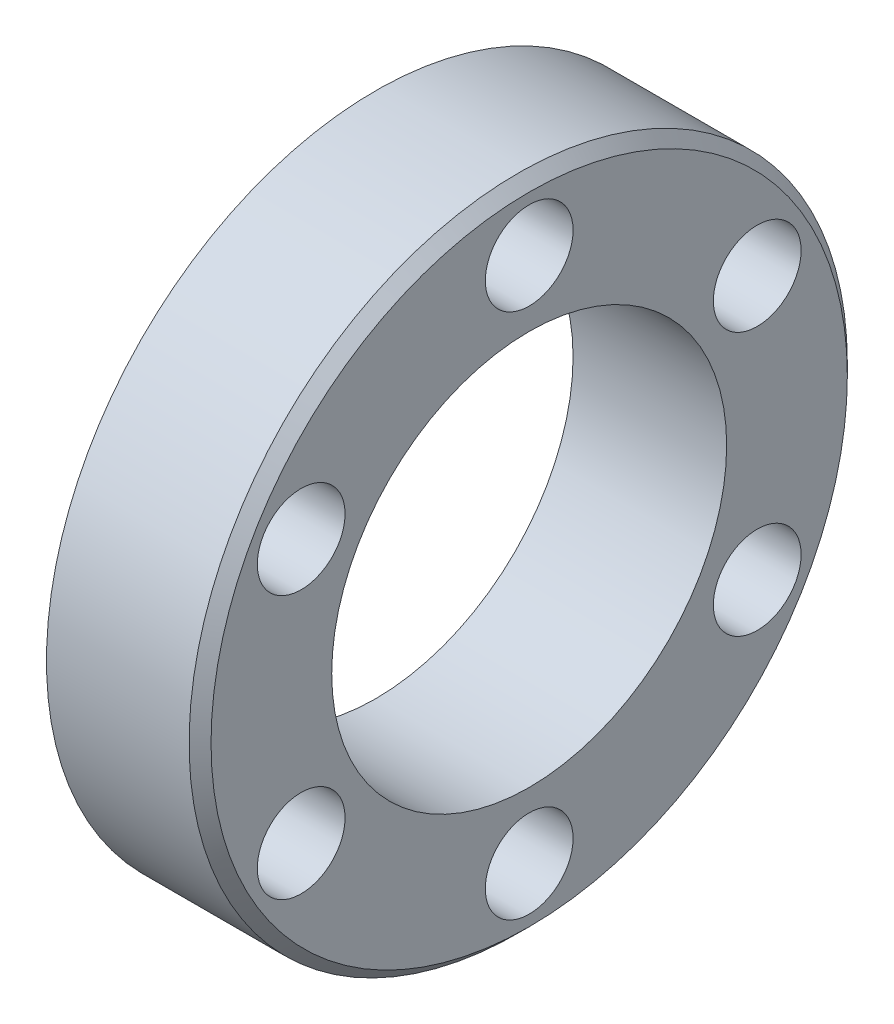
ISO-10303-21;
HEADER;
FILE_DESCRIPTION(('STEP AP214'),'2;1');
FILE_NAME('part.step','',(''),(''),'','','');
FILE_SCHEMA(('AUTOMOTIVE_DESIGN { 1 0 10303 214 1 1 1 1 }'));
ENDSEC;
DATA;
#1=APPLICATION_CONTEXT('core data for automotive mechanical design processes');
#2=APPLICATION_PROTOCOL_DEFINITION('international standard','automotive_design',2000,#1);
#3=PRODUCT_CONTEXT('',#1,'mechanical');
#4=PRODUCT('Part','Part','',(#3));
#5=PRODUCT_RELATED_PRODUCT_CATEGORY('part','',(#4));
#6=PRODUCT_DEFINITION_FORMATION('','',#4);
#7=PRODUCT_DEFINITION_CONTEXT('part definition',#1,'design');
#8=PRODUCT_DEFINITION('design','',#6,#7);
#9=PRODUCT_DEFINITION_SHAPE('','',#8);
#10=(LENGTH_UNIT() NAMED_UNIT(*) SI_UNIT(.MILLI.,.METRE.));
#11=(NAMED_UNIT(*) PLANE_ANGLE_UNIT() SI_UNIT($,.RADIAN.));
#12=(NAMED_UNIT(*) SI_UNIT($,.STERADIAN.) SOLID_ANGLE_UNIT());
#13=UNCERTAINTY_MEASURE_WITH_UNIT(LENGTH_MEASURE(1.E-05),#10,'distance_accuracy_value','');
#14=(GEOMETRIC_REPRESENTATION_CONTEXT(3) GLOBAL_UNCERTAINTY_ASSIGNED_CONTEXT((#13)) GLOBAL_UNIT_ASSIGNED_CONTEXT((#10,
#11,#12)) REPRESENTATION_CONTEXT('',''));
#15=CARTESIAN_POINT('',(0.,0.,0.));
#16=DIRECTION('',(0.,0.,1.));
#17=DIRECTION('',(1.,0.,0.));
#18=AXIS2_PLACEMENT_3D('',#15,#16,#17);
#19=CARTESIAN_POINT('',(7.,0.,0.));
#20=DIRECTION('',(1.,0.,0.));
#21=DIRECTION('',(0.,0.,-1.));
#22=AXIS2_PLACEMENT_3D('',#19,#20,#21);
#23=PLANE('',#22);
#24=CARTESIAN_POINT('',(7.,0.,0.));
#25=DIRECTION('',(1.,0.,0.));
#26=DIRECTION('',(0.,0.,-1.));
#27=AXIS2_PLACEMENT_3D('',#24,#25,#26);
#28=CIRCLE('',#27,14.5);
#29=CARTESIAN_POINT('',(7.,0.,-14.5));
#30=VERTEX_POINT('',#29);
#31=EDGE_CURVE('E44',#30,#30,#28,.T.);
#32=ORIENTED_EDGE('',*,*,#31,.T.);
#33=EDGE_LOOP('',(#32));
#34=FACE_BOUND('',#33,.T.);
#35=CARTESIAN_POINT('',(7.,6.00000000000012,10.3923048454132));
#36=DIRECTION('',(1.,0.,0.));
#37=DIRECTION('',(0.,0.,-1.));
#38=AXIS2_PLACEMENT_3D('',#35,#36,#37);
#39=CIRCLE('',#38,1.99999999999999);
#40=CARTESIAN_POINT('',(7.,6.00000000000012,8.3923048454132));
#41=VERTEX_POINT('',#40);
#42=EDGE_CURVE('E93',#41,#41,#39,.T.);
#43=ORIENTED_EDGE('',*,*,#42,.F.);
#44=EDGE_LOOP('',(#43));
#45=FACE_BOUND('',#44,.T.);
#46=CARTESIAN_POINT('',(7.,-5.9999999999999,10.3923048454133));
#47=DIRECTION('',(1.,0.,0.));
#48=DIRECTION('',(0.,0.,-1.));
#49=AXIS2_PLACEMENT_3D('',#46,#47,#48);
#50=CIRCLE('',#49,1.99999999999999);
#51=CARTESIAN_POINT('',(7.,-5.9999999999999,8.39230484541333));
#52=VERTEX_POINT('',#51);
#53=EDGE_CURVE('E58',#52,#52,#50,.T.);
#54=ORIENTED_EDGE('',*,*,#53,.F.);
#55=EDGE_LOOP('',(#54));
#56=FACE_BOUND('',#55,.T.);
#57=CARTESIAN_POINT('',(7.,-12.,0.));
#58=DIRECTION('',(1.,0.,0.));
#59=DIRECTION('',(0.,0.,-1.));
#60=AXIS2_PLACEMENT_3D('',#57,#58,#59);
#61=CIRCLE('',#60,1.99999999999999);
#62=CARTESIAN_POINT('',(7.,-12.,-1.99999999999999));
#63=VERTEX_POINT('',#62);
#64=EDGE_CURVE('E57',#63,#63,#61,.T.);
#65=ORIENTED_EDGE('',*,*,#64,.F.);
#66=EDGE_LOOP('',(#65));
#67=FACE_BOUND('',#66,.T.);
#68=CARTESIAN_POINT('',(7.,-6.00000000000005,-10.3923048454132));
#69=DIRECTION('',(1.,0.,0.));
#70=DIRECTION('',(0.,0.,-1.));
#71=AXIS2_PLACEMENT_3D('',#68,#69,#70);
#72=CIRCLE('',#71,1.99999999999999);
#73=CARTESIAN_POINT('',(7.,-6.00000000000005,-12.3923048454132));
#74=VERTEX_POINT('',#73);
#75=EDGE_CURVE('E80',#74,#74,#72,.T.);
#76=ORIENTED_EDGE('',*,*,#75,.F.);
#77=EDGE_LOOP('',(#76));
#78=FACE_BOUND('',#77,.T.);
#79=CARTESIAN_POINT('',(7.,5.99999999999998,-10.3923048454133));
#80=DIRECTION('',(1.,0.,0.));
#81=DIRECTION('',(0.,0.,-1.));
#82=AXIS2_PLACEMENT_3D('',#79,#80,#81);
#83=CIRCLE('',#82,1.99999999999999);
#84=CARTESIAN_POINT('',(7.,5.99999999999998,-12.3923048454133));
#85=VERTEX_POINT('',#84);
#86=EDGE_CURVE('E74',#85,#85,#83,.T.);
#87=ORIENTED_EDGE('',*,*,#86,.F.);
#88=EDGE_LOOP('',(#87));
#89=FACE_BOUND('',#88,.T.);
#90=CARTESIAN_POINT('',(7.,12.,0.));
#91=DIRECTION('',(1.,0.,0.));
#92=DIRECTION('',(0.,0.,-1.));
#93=AXIS2_PLACEMENT_3D('',#90,#91,#92);
#94=CIRCLE('',#93,1.99999999999999);
#95=CARTESIAN_POINT('',(7.,12.,-1.99999999999999));
#96=VERTEX_POINT('',#95);
#97=EDGE_CURVE('E68',#96,#96,#94,.T.);
#98=ORIENTED_EDGE('',*,*,#97,.F.);
#99=EDGE_LOOP('',(#98));
#100=FACE_BOUND('',#99,.T.);
#101=CARTESIAN_POINT('',(7.,0.,0.));
#102=DIRECTION('',(1.,0.,0.));
#103=DIRECTION('',(0.,0.,-1.));
#104=AXIS2_PLACEMENT_3D('',#101,#102,#103);
#105=CIRCLE('',#104,9.);
#106=CARTESIAN_POINT('',(7.,0.,-9.));
#107=VERTEX_POINT('',#106);
#108=EDGE_CURVE('E52',#107,#107,#105,.T.);
#109=ORIENTED_EDGE('',*,*,#108,.F.);
#110=EDGE_LOOP('',(#109));
#111=FACE_BOUND('',#110,.T.);
#112=ADVANCED_FACE('F36',(#34,#45,#56,#67,#78,#89,#100,#111),#23,.T.);
#113=CARTESIAN_POINT('',(0.,0.,0.));
#114=DIRECTION('',(1.,0.,0.));
#115=DIRECTION('',(0.,0.,-1.));
#116=AXIS2_PLACEMENT_3D('',#113,#114,#115);
#117=PLANE('',#116);
#118=CARTESIAN_POINT('',(0.,6.00000000000012,10.3923048454132));
#119=DIRECTION('',(1.,0.,0.));
#120=DIRECTION('',(0.,0.,-1.));
#121=AXIS2_PLACEMENT_3D('',#118,#119,#120);
#122=CIRCLE('',#121,1.99999999999999);
#123=CARTESIAN_POINT('',(0.,6.00000000000012,8.3923048454132));
#124=VERTEX_POINT('',#123);
#125=EDGE_CURVE('E90',#124,#124,#122,.T.);
#126=ORIENTED_EDGE('',*,*,#125,.T.);
#127=EDGE_LOOP('',(#126));
#128=FACE_BOUND('',#127,.T.);
#129=CARTESIAN_POINT('',(0.,-5.9999999999999,10.3923048454133));
#130=DIRECTION('',(1.,0.,0.));
#131=DIRECTION('',(0.,0.,-1.));
#132=AXIS2_PLACEMENT_3D('',#129,#130,#131);
#133=CIRCLE('',#132,1.99999999999999);
#134=CARTESIAN_POINT('',(0.,-5.9999999999999,8.39230484541333));
#135=VERTEX_POINT('',#134);
#136=EDGE_CURVE('E55',#135,#135,#133,.T.);
#137=ORIENTED_EDGE('',*,*,#136,.T.);
#138=EDGE_LOOP('',(#137));
#139=FACE_BOUND('',#138,.T.);
#140=CARTESIAN_POINT('',(0.,-12.,0.));
#141=DIRECTION('',(1.,0.,0.));
#142=DIRECTION('',(0.,0.,-1.));
#143=AXIS2_PLACEMENT_3D('',#140,#141,#142);
#144=CIRCLE('',#143,1.99999999999999);
#145=CARTESIAN_POINT('',(0.,-12.,-1.99999999999999));
#146=VERTEX_POINT('',#145);
#147=EDGE_CURVE('E83',#146,#146,#144,.T.);
#148=ORIENTED_EDGE('',*,*,#147,.T.);
#149=EDGE_LOOP('',(#148));
#150=FACE_BOUND('',#149,.T.);
#151=CARTESIAN_POINT('',(0.,-6.00000000000005,-10.3923048454132));
#152=DIRECTION('',(1.,0.,0.));
#153=DIRECTION('',(0.,0.,-1.));
#154=AXIS2_PLACEMENT_3D('',#151,#152,#153);
#155=CIRCLE('',#154,1.99999999999999);
#156=CARTESIAN_POINT('',(0.,-6.00000000000005,-12.3923048454132));
#157=VERTEX_POINT('',#156);
#158=EDGE_CURVE('E77',#157,#157,#155,.T.);
#159=ORIENTED_EDGE('',*,*,#158,.T.);
#160=EDGE_LOOP('',(#159));
#161=FACE_BOUND('',#160,.T.);
#162=CARTESIAN_POINT('',(0.,5.99999999999998,-10.3923048454133));
#163=DIRECTION('',(1.,0.,0.));
#164=DIRECTION('',(0.,0.,-1.));
#165=AXIS2_PLACEMENT_3D('',#162,#163,#164);
#166=CIRCLE('',#165,1.99999999999999);
#167=CARTESIAN_POINT('',(0.,5.99999999999998,-12.3923048454133));
#168=VERTEX_POINT('',#167);
#169=EDGE_CURVE('E71',#168,#168,#166,.T.);
#170=ORIENTED_EDGE('',*,*,#169,.T.);
#171=EDGE_LOOP('',(#170));
#172=FACE_BOUND('',#171,.T.);
#173=CARTESIAN_POINT('',(0.,12.,0.));
#174=DIRECTION('',(1.,0.,0.));
#175=DIRECTION('',(0.,0.,-1.));
#176=AXIS2_PLACEMENT_3D('',#173,#174,#175);
#177=CIRCLE('',#176,1.99999999999999);
#178=CARTESIAN_POINT('',(0.,12.,-1.99999999999999));
#179=VERTEX_POINT('',#178);
#180=EDGE_CURVE('E63',#179,#179,#177,.T.);
#181=ORIENTED_EDGE('',*,*,#180,.T.);
#182=EDGE_LOOP('',(#181));
#183=FACE_BOUND('',#182,.T.);
#184=CARTESIAN_POINT('',(0.,0.,0.));
#185=DIRECTION('',(1.,0.,0.));
#186=DIRECTION('',(0.,0.,-1.));
#187=AXIS2_PLACEMENT_3D('',#184,#185,#186);
#188=CIRCLE('',#187,15.);
#189=CARTESIAN_POINT('',(0.,0.,-15.));
#190=VERTEX_POINT('',#189);
#191=EDGE_CURVE('E48',#190,#190,#188,.T.);
#192=ORIENTED_EDGE('',*,*,#191,.F.);
#193=EDGE_LOOP('',(#192));
#194=FACE_BOUND('',#193,.T.);
#195=CARTESIAN_POINT('',(0.,0.,0.));
#196=DIRECTION('',(1.,0.,0.));
#197=DIRECTION('',(0.,0.,-1.));
#198=AXIS2_PLACEMENT_3D('',#195,#196,#197);
#199=CIRCLE('',#198,9.);
#200=CARTESIAN_POINT('',(0.,0.,-9.));
#201=VERTEX_POINT('',#200);
#202=EDGE_CURVE('E60',#201,#201,#199,.T.);
#203=ORIENTED_EDGE('',*,*,#202,.T.);
#204=EDGE_LOOP('',(#203));
#205=FACE_BOUND('',#204,.T.);
#206=ADVANCED_FACE('F102',(#128,#139,#150,#161,#172,#183,#194,#205),#117,.F.);
#207=CARTESIAN_POINT('',(7.,0.,0.));
#208=DIRECTION('',(-1.,0.,0.));
#209=DIRECTION('',(0.,0.,1.));
#210=AXIS2_PLACEMENT_3D('',#207,#208,#209);
#211=CYLINDRICAL_SURFACE('',#210,15.);
#212=CARTESIAN_POINT('',(6.5,0.,0.));
#213=DIRECTION('',(1.,0.,0.));
#214=DIRECTION('',(0.,0.,-1.));
#215=AXIS2_PLACEMENT_3D('',#212,#213,#214);
#216=CIRCLE('',#215,15.);
#217=CARTESIAN_POINT('',(6.5,0.,-15.));
#218=VERTEX_POINT('',#217);
#219=EDGE_CURVE('E10',#218,#218,#216,.F.);
#220=ORIENTED_EDGE('',*,*,#219,.T.);
#221=EDGE_LOOP('',(#220));
#222=FACE_BOUND('',#221,.T.);
#223=ORIENTED_EDGE('',*,*,#191,.T.);
#224=EDGE_LOOP('',(#223));
#225=FACE_BOUND('',#224,.T.);
#226=ADVANCED_FACE('F120',(#222,#225),#211,.T.);
#227=CARTESIAN_POINT('',(7.,0.,0.));
#228=DIRECTION('',(-1.,0.,0.));
#229=DIRECTION('',(0.,0.,1.));
#230=AXIS2_PLACEMENT_3D('',#227,#228,#229);
#231=CYLINDRICAL_SURFACE('',#230,9.);
#232=ORIENTED_EDGE('',*,*,#108,.T.);
#233=EDGE_LOOP('',(#232));
#234=FACE_BOUND('',#233,.T.);
#235=ORIENTED_EDGE('',*,*,#202,.F.);
#236=EDGE_LOOP('',(#235));
#237=FACE_BOUND('',#236,.T.);
#238=ADVANCED_FACE('F116',(#234,#237),#231,.F.);
#239=CARTESIAN_POINT('',(7.,12.,0.));
#240=DIRECTION('',(1.,0.,0.));
#241=DIRECTION('',(0.,0.,-1.));
#242=AXIS2_PLACEMENT_3D('',#239,#240,#241);
#243=CYLINDRICAL_SURFACE('',#242,1.99999999999999);
#244=ORIENTED_EDGE('',*,*,#97,.T.);
#245=EDGE_LOOP('',(#244));
#246=FACE_BOUND('',#245,.T.);
#247=ORIENTED_EDGE('',*,*,#180,.F.);
#248=EDGE_LOOP('',(#247));
#249=FACE_BOUND('',#248,.T.);
#250=ADVANCED_FACE('F119',(#246,#249),#243,.F.);
#251=CARTESIAN_POINT('',(7.,5.99999999999998,-10.3923048454133));
#252=DIRECTION('',(1.,0.,0.));
#253=DIRECTION('',(0.,0.,-1.));
#254=AXIS2_PLACEMENT_3D('',#251,#252,#253);
#255=CYLINDRICAL_SURFACE('',#254,1.99999999999999);
#256=ORIENTED_EDGE('',*,*,#86,.T.);
#257=EDGE_LOOP('',(#256));
#258=FACE_BOUND('',#257,.T.);
#259=ORIENTED_EDGE('',*,*,#169,.F.);
#260=EDGE_LOOP('',(#259));
#261=FACE_BOUND('',#260,.T.);
#262=ADVANCED_FACE('F134',(#258,#261),#255,.F.);
#263=CARTESIAN_POINT('',(7.,-6.00000000000005,-10.3923048454132));
#264=DIRECTION('',(1.,0.,0.));
#265=DIRECTION('',(0.,0.,-1.));
#266=AXIS2_PLACEMENT_3D('',#263,#264,#265);
#267=CYLINDRICAL_SURFACE('',#266,1.99999999999999);
#268=ORIENTED_EDGE('',*,*,#75,.T.);
#269=EDGE_LOOP('',(#268));
#270=FACE_BOUND('',#269,.T.);
#271=ORIENTED_EDGE('',*,*,#158,.F.);
#272=EDGE_LOOP('',(#271));
#273=FACE_BOUND('',#272,.T.);
#274=ADVANCED_FACE('F138',(#270,#273),#267,.F.);
#275=CARTESIAN_POINT('',(7.,-12.,0.));
#276=DIRECTION('',(1.,0.,0.));
#277=DIRECTION('',(0.,0.,-1.));
#278=AXIS2_PLACEMENT_3D('',#275,#276,#277);
#279=CYLINDRICAL_SURFACE('',#278,1.99999999999999);
#280=ORIENTED_EDGE('',*,*,#64,.T.);
#281=EDGE_LOOP('',(#280));
#282=FACE_BOUND('',#281,.T.);
#283=ORIENTED_EDGE('',*,*,#147,.F.);
#284=EDGE_LOOP('',(#283));
#285=FACE_BOUND('',#284,.T.);
#286=ADVANCED_FACE('F142',(#282,#285),#279,.F.);
#287=CARTESIAN_POINT('',(7.,-5.9999999999999,10.3923048454133));
#288=DIRECTION('',(1.,0.,0.));
#289=DIRECTION('',(0.,0.,-1.));
#290=AXIS2_PLACEMENT_3D('',#287,#288,#289);
#291=CYLINDRICAL_SURFACE('',#290,1.99999999999999);
#292=ORIENTED_EDGE('',*,*,#53,.T.);
#293=EDGE_LOOP('',(#292));
#294=FACE_BOUND('',#293,.T.);
#295=ORIENTED_EDGE('',*,*,#136,.F.);
#296=EDGE_LOOP('',(#295));
#297=FACE_BOUND('',#296,.T.);
#298=ADVANCED_FACE('F146',(#294,#297),#291,.F.);
#299=CARTESIAN_POINT('',(7.,6.00000000000012,10.3923048454132));
#300=DIRECTION('',(1.,0.,0.));
#301=DIRECTION('',(0.,0.,-1.));
#302=AXIS2_PLACEMENT_3D('',#299,#300,#301);
#303=CYLINDRICAL_SURFACE('',#302,1.99999999999999);
#304=ORIENTED_EDGE('',*,*,#42,.T.);
#305=EDGE_LOOP('',(#304));
#306=FACE_BOUND('',#305,.T.);
#307=ORIENTED_EDGE('',*,*,#125,.F.);
#308=EDGE_LOOP('',(#307));
#309=FACE_BOUND('',#308,.T.);
#310=ADVANCED_FACE('F97',(#306,#309),#303,.F.);
#311=CARTESIAN_POINT('',(7.,0.,0.));
#312=DIRECTION('',(-1.,0.,0.));
#313=DIRECTION('',(0.,0.,1.));
#314=AXIS2_PLACEMENT_3D('',#311,#312,#313);
#315=CONICAL_SURFACE('',#314,14.5,0.78539816339745);
#316=ORIENTED_EDGE('',*,*,#219,.F.);
#317=EDGE_LOOP('',(#316));
#318=FACE_BOUND('',#317,.T.);
#319=ORIENTED_EDGE('',*,*,#31,.F.);
#320=EDGE_LOOP('',(#319));
#321=FACE_BOUND('',#320,.T.);
#322=ADVANCED_FACE('F39',(#318,#321),#315,.T.);
#323=CLOSED_SHELL('',(#112,#206,#226,#238,#250,#262,#274,#286,#298,#310,#322));
#324=MANIFOLD_SOLID_BREP('B2',#323);
#325=ADVANCED_BREP_SHAPE_REPRESENTATION('',(#18,#324),#14);
#326=SHAPE_DEFINITION_REPRESENTATION(#9,#325);
ENDSEC;
END-ISO-10303-21;
